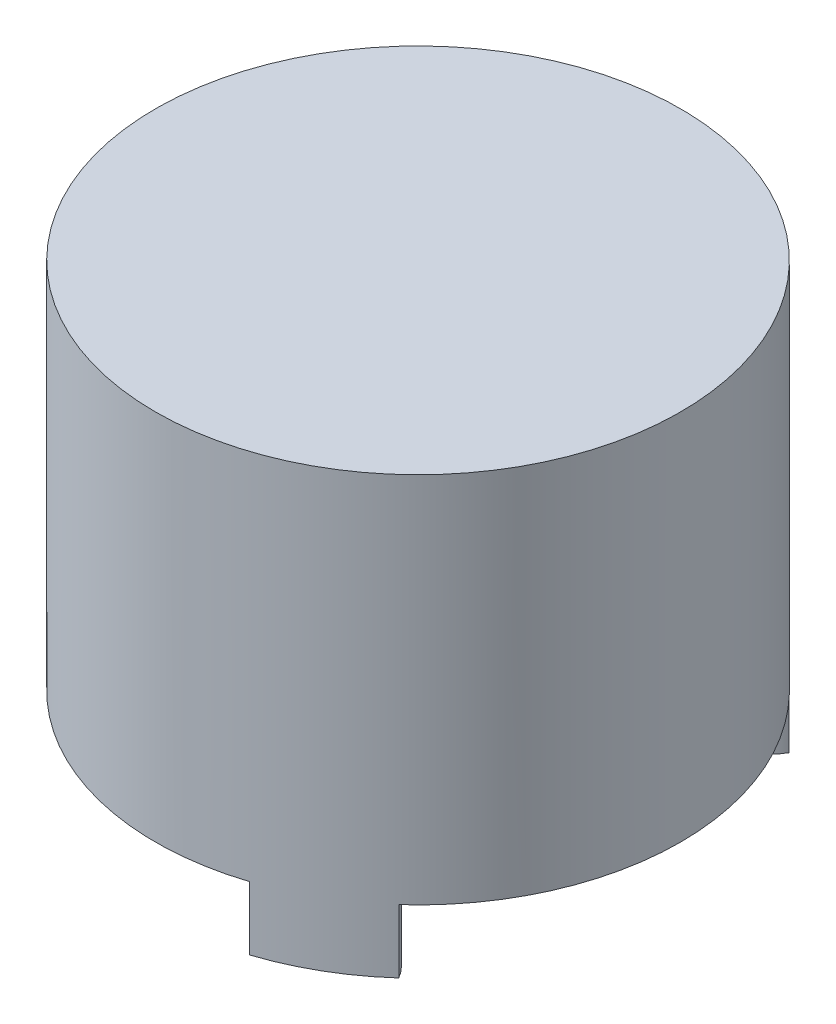
ISO-10303-21;
HEADER;
FILE_DESCRIPTION(('STEP AP214'),'2;1');
FILE_NAME('part.step','',(''),(''),'','','');
FILE_SCHEMA(('AUTOMOTIVE_DESIGN { 1 0 10303 214 1 1 1 1 }'));
ENDSEC;
DATA;
#1=APPLICATION_CONTEXT('core data for automotive mechanical design processes');
#2=APPLICATION_PROTOCOL_DEFINITION('international standard','automotive_design',2000,#1);
#3=PRODUCT_CONTEXT('',#1,'mechanical');
#4=PRODUCT('Part','Part','',(#3));
#5=PRODUCT_RELATED_PRODUCT_CATEGORY('part','',(#4));
#6=PRODUCT_DEFINITION_FORMATION('','',#4);
#7=PRODUCT_DEFINITION_CONTEXT('part definition',#1,'design');
#8=PRODUCT_DEFINITION('design','',#6,#7);
#9=PRODUCT_DEFINITION_SHAPE('','',#8);
#10=(LENGTH_UNIT() NAMED_UNIT(*) SI_UNIT(.MILLI.,.METRE.));
#11=(NAMED_UNIT(*) PLANE_ANGLE_UNIT() SI_UNIT($,.RADIAN.));
#12=(NAMED_UNIT(*) SI_UNIT($,.STERADIAN.) SOLID_ANGLE_UNIT());
#13=UNCERTAINTY_MEASURE_WITH_UNIT(LENGTH_MEASURE(1.E-05),#10,'distance_accuracy_value','');
#14=(GEOMETRIC_REPRESENTATION_CONTEXT(3) GLOBAL_UNCERTAINTY_ASSIGNED_CONTEXT((#13)) GLOBAL_UNIT_ASSIGNED_CONTEXT((#10,
#11,#12)) REPRESENTATION_CONTEXT('',''));
#15=CARTESIAN_POINT('',(0.,0.,0.));
#16=DIRECTION('',(0.,0.,1.));
#17=DIRECTION('',(1.,0.,0.));
#18=AXIS2_PLACEMENT_3D('',#15,#16,#17);
#19=CARTESIAN_POINT('',(0.,139.5,84.));
#20=DIRECTION('',(0.,1.,0.));
#21=DIRECTION('',(0.,0.,1.));
#22=AXIS2_PLACEMENT_3D('',#19,#20,#21);
#23=PLANE('',#22);
#24=CARTESIAN_POINT('',(0.,139.5,0.));
#25=DIRECTION('',(0.,1.,0.));
#26=DIRECTION('',(0.,0.,1.));
#27=AXIS2_PLACEMENT_3D('',#24,#25,#26);
#28=CIRCLE('',#27,84.);
#29=CARTESIAN_POINT('',(0.,139.5,84.));
#30=VERTEX_POINT('',#29);
#31=EDGE_CURVE('E101',#30,#30,#28,.T.);
#32=ORIENTED_EDGE('',*,*,#31,.T.);
#33=EDGE_LOOP('',(#32));
#34=FACE_BOUND('',#33,.T.);
#35=ADVANCED_FACE('F36',(#34),#23,.T.);
#36=CARTESIAN_POINT('',(0.,203.,0.));
#37=DIRECTION('',(0.,-1.,0.));
#38=DIRECTION('',(0.,0.,-1.));
#39=AXIS2_PLACEMENT_3D('',#36,#37,#38);
#40=CYLINDRICAL_SURFACE('',#39,84.);
#41=ORIENTED_EDGE('',*,*,#31,.F.);
#42=EDGE_LOOP('',(#41));
#43=FACE_BOUND('',#42,.T.);
#44=CARTESIAN_POINT('',(0.,20.32,0.));
#45=DIRECTION('',(0.,-1.,0.));
#46=DIRECTION('',(0.,0.,-1.));
#47=AXIS2_PLACEMENT_3D('',#44,#45,#46);
#48=CIRCLE('',#47,84.);
#49=CARTESIAN_POINT('',(56.233875646297,20.32,-62.3999297258964));
#50=VERTEX_POINT('',#49);
#51=CARTESIAN_POINT('',(56.2338756462969,20.32,62.3999297258965));
#52=VERTEX_POINT('',#51);
#53=EDGE_CURVE('E124',#50,#52,#48,.T.);
#54=ORIENTED_EDGE('',*,*,#53,.F.);
#55=DIRECTION('',(0.,-1.,0.));
#56=VECTOR('',#55,1.);
#57=CARTESIAN_POINT('',(56.233875646297,20.32,-62.3999297258964));
#58=LINE('',#57,#56);
#59=CARTESIAN_POINT('',(56.233875646297,0.,-62.3999297258964));
#60=VERTEX_POINT('',#59);
#61=EDGE_CURVE('E89',#50,#60,#58,.T.);
#62=ORIENTED_EDGE('',*,*,#61,.T.);
#63=CARTESIAN_POINT('',(0.,0.,0.));
#64=DIRECTION('',(0.,1.,0.));
#65=DIRECTION('',(0.,0.,1.));
#66=AXIS2_PLACEMENT_3D('',#63,#64,#65);
#67=CIRCLE('',#66,84.);
#68=CARTESIAN_POINT('',(25.9229865138416,0.,-79.8999297258964));
#69=VERTEX_POINT('',#68);
#70=EDGE_CURVE('E94',#60,#69,#67,.T.);
#71=ORIENTED_EDGE('',*,*,#70,.T.);
#72=DIRECTION('',(0.,-1.,0.));
#73=VECTOR('',#72,1.);
#74=CARTESIAN_POINT('',(25.9229865138416,20.32,-79.8999297258964));
#75=LINE('',#74,#73);
#76=CARTESIAN_POINT('',(25.9229865138416,20.32,-79.8999297258964));
#77=VERTEX_POINT('',#76);
#78=EDGE_CURVE('E84',#77,#69,#75,.T.);
#79=ORIENTED_EDGE('',*,*,#78,.F.);
#80=CARTESIAN_POINT('',(-82.1568621601385,20.32,-17.5));
#81=VERTEX_POINT('',#80);
#82=EDGE_CURVE('E103',#81,#77,#48,.T.);
#83=ORIENTED_EDGE('',*,*,#82,.F.);
#84=DIRECTION('',(0.,-1.,0.));
#85=VECTOR('',#84,1.);
#86=CARTESIAN_POINT('',(-82.1568621601385,20.32,-17.5));
#87=LINE('',#86,#85);
#88=CARTESIAN_POINT('',(-82.1568621601385,0.,-17.5));
#89=VERTEX_POINT('',#88);
#90=EDGE_CURVE('E114',#81,#89,#87,.T.);
#91=ORIENTED_EDGE('',*,*,#90,.T.);
#92=CARTESIAN_POINT('',(-82.1568621601385,0.,17.5));
#93=VERTEX_POINT('',#92);
#94=EDGE_CURVE('E97',#89,#93,#67,.T.);
#95=ORIENTED_EDGE('',*,*,#94,.T.);
#96=DIRECTION('',(0.,-1.,0.));
#97=VECTOR('',#96,1.);
#98=CARTESIAN_POINT('',(-82.1568621601385,20.32,17.5));
#99=LINE('',#98,#97);
#100=CARTESIAN_POINT('',(-82.1568621601385,20.32,17.5));
#101=VERTEX_POINT('',#100);
#102=EDGE_CURVE('E112',#101,#93,#99,.T.);
#103=ORIENTED_EDGE('',*,*,#102,.F.);
#104=CARTESIAN_POINT('',(25.9229865138416,20.32,79.8999297258964));
#105=VERTEX_POINT('',#104);
#106=EDGE_CURVE('E123',#105,#101,#48,.T.);
#107=ORIENTED_EDGE('',*,*,#106,.F.);
#108=DIRECTION('',(0.,-1.,0.));
#109=VECTOR('',#108,1.);
#110=CARTESIAN_POINT('',(25.9229865138416,20.32,79.8999297258964));
#111=LINE('',#110,#109);
#112=CARTESIAN_POINT('',(25.9229865138416,0.,79.8999297258964));
#113=VERTEX_POINT('',#112);
#114=EDGE_CURVE('E108',#105,#113,#111,.T.);
#115=ORIENTED_EDGE('',*,*,#114,.T.);
#116=CARTESIAN_POINT('',(56.2338756462969,0.,62.3999297258965));
#117=VERTEX_POINT('',#116);
#118=EDGE_CURVE('E98',#113,#117,#67,.T.);
#119=ORIENTED_EDGE('',*,*,#118,.T.);
#120=DIRECTION('',(0.,-1.,0.));
#121=VECTOR('',#120,1.);
#122=CARTESIAN_POINT('',(56.2338756462969,20.32,62.3999297258965));
#123=LINE('',#122,#121);
#124=EDGE_CURVE('E106',#52,#117,#123,.T.);
#125=ORIENTED_EDGE('',*,*,#124,.F.);
#126=EDGE_LOOP('',(#54,#62,#71,#79,#83,#91,#95,#103,#107,#115,#119,#125));
#127=FACE_BOUND('',#126,.T.);
#128=ADVANCED_FACE('F96',(#43,#127),#40,.T.);
#129=CARTESIAN_POINT('',(0.,0.,0.));
#130=DIRECTION('',(0.,1.,0.));
#131=DIRECTION('',(0.,0.,1.));
#132=AXIS2_PLACEMENT_3D('',#129,#130,#131);
#133=PLANE('',#132);
#134=CARTESIAN_POINT('',(-82.1568621601385,0.,0.));
#135=DIRECTION('',(0.,-1.,0.));
#136=DIRECTION('',(0.,0.,1.));
#137=AXIS2_PLACEMENT_3D('',#134,#135,#136);
#138=CIRCLE('',#137,17.5);
#139=EDGE_CURVE('E111',#89,#93,#138,.T.);
#140=ORIENTED_EDGE('',*,*,#139,.T.);
#141=ORIENTED_EDGE('',*,*,#94,.F.);
#142=EDGE_LOOP('',(#140,#141));
#143=FACE_BOUND('',#142,.T.);
#144=ADVANCED_FACE('F144',(#143),#133,.F.);
#145=CARTESIAN_POINT('',(41.0784310800692,0.,71.1499297258965));
#146=DIRECTION('',(0.,-1.,0.));
#147=DIRECTION('',(0.,0.,1.));
#148=AXIS2_PLACEMENT_3D('',#145,#146,#147);
#149=CIRCLE('',#148,17.5);
#150=EDGE_CURVE('E119',#113,#117,#149,.T.);
#151=ORIENTED_EDGE('',*,*,#150,.T.);
#152=ORIENTED_EDGE('',*,*,#118,.F.);
#153=EDGE_LOOP('',(#151,#152));
#154=FACE_BOUND('',#153,.T.);
#155=ADVANCED_FACE('F142',(#154),#133,.F.);
#156=CARTESIAN_POINT('',(41.0784310800693,0.,-71.1499297258964));
#157=DIRECTION('',(0.,-1.,0.));
#158=DIRECTION('',(0.,0.,1.));
#159=AXIS2_PLACEMENT_3D('',#156,#157,#158);
#160=CIRCLE('',#159,17.5);
#161=EDGE_CURVE('E11',#60,#69,#160,.T.);
#162=ORIENTED_EDGE('',*,*,#161,.T.);
#163=ORIENTED_EDGE('',*,*,#70,.F.);
#164=EDGE_LOOP('',(#162,#163));
#165=FACE_BOUND('',#164,.T.);
#166=ADVANCED_FACE('F93',(#165),#133,.F.);
#167=CARTESIAN_POINT('',(0.,20.32,0.));
#168=DIRECTION('',(0.,-1.,0.));
#169=DIRECTION('',(0.,0.,-1.));
#170=AXIS2_PLACEMENT_3D('',#167,#168,#169);
#171=PLANE('',#170);
#172=ORIENTED_EDGE('',*,*,#53,.T.);
#173=CARTESIAN_POINT('',(41.0784310800692,20.32,71.1499297258965));
#174=DIRECTION('',(0.,-1.,0.));
#175=DIRECTION('',(0.,0.,1.));
#176=AXIS2_PLACEMENT_3D('',#173,#174,#175);
#177=CIRCLE('',#176,17.5);
#178=EDGE_CURVE('E39',#105,#52,#177,.T.);
#179=ORIENTED_EDGE('',*,*,#178,.F.);
#180=ORIENTED_EDGE('',*,*,#106,.T.);
#181=CARTESIAN_POINT('',(-82.1568621601385,20.32,0.));
#182=DIRECTION('',(0.,-1.,0.));
#183=DIRECTION('',(0.,0.,1.));
#184=AXIS2_PLACEMENT_3D('',#181,#182,#183);
#185=CIRCLE('',#184,17.5);
#186=EDGE_CURVE('E116',#81,#101,#185,.T.);
#187=ORIENTED_EDGE('',*,*,#186,.F.);
#188=ORIENTED_EDGE('',*,*,#82,.T.);
#189=CARTESIAN_POINT('',(41.0784310800693,20.32,-71.1499297258964));
#190=DIRECTION('',(0.,-1.,0.));
#191=DIRECTION('',(0.,0.,1.));
#192=AXIS2_PLACEMENT_3D('',#189,#190,#191);
#193=CIRCLE('',#192,17.5);
#194=EDGE_CURVE('E45',#50,#77,#193,.T.);
#195=ORIENTED_EDGE('',*,*,#194,.F.);
#196=EDGE_LOOP('',(#172,#179,#180,#187,#188,#195));
#197=FACE_BOUND('',#196,.T.);
#198=ADVANCED_FACE('F150',(#197),#171,.T.);
#199=CARTESIAN_POINT('',(-82.1568621601385,20.32,0.));
#200=DIRECTION('',(0.,-1.,0.));
#201=DIRECTION('',(0.,0.,-1.));
#202=AXIS2_PLACEMENT_3D('',#199,#200,#201);
#203=CYLINDRICAL_SURFACE('',#202,17.5);
#204=ORIENTED_EDGE('',*,*,#139,.F.);
#205=ORIENTED_EDGE('',*,*,#90,.F.);
#206=ORIENTED_EDGE('',*,*,#186,.T.);
#207=ORIENTED_EDGE('',*,*,#102,.T.);
#208=EDGE_LOOP('',(#204,#205,#206,#207));
#209=FACE_BOUND('',#208,.T.);
#210=ADVANCED_FACE('F166',(#209),#203,.T.);
#211=CARTESIAN_POINT('',(41.0784310800692,20.32,71.1499297258965));
#212=DIRECTION('',(0.,-1.,0.));
#213=DIRECTION('',(0.,0.,-1.));
#214=AXIS2_PLACEMENT_3D('',#211,#212,#213);
#215=CYLINDRICAL_SURFACE('',#214,17.5);
#216=ORIENTED_EDGE('',*,*,#150,.F.);
#217=ORIENTED_EDGE('',*,*,#114,.F.);
#218=ORIENTED_EDGE('',*,*,#178,.T.);
#219=ORIENTED_EDGE('',*,*,#124,.T.);
#220=EDGE_LOOP('',(#216,#217,#218,#219));
#221=FACE_BOUND('',#220,.T.);
#222=ADVANCED_FACE('F140',(#221),#215,.T.);
#223=CARTESIAN_POINT('',(41.0784310800693,20.32,-71.1499297258964));
#224=DIRECTION('',(0.,-1.,0.));
#225=DIRECTION('',(0.,0.,-1.));
#226=AXIS2_PLACEMENT_3D('',#223,#224,#225);
#227=CYLINDRICAL_SURFACE('',#226,17.5);
#228=ORIENTED_EDGE('',*,*,#161,.F.);
#229=ORIENTED_EDGE('',*,*,#61,.F.);
#230=ORIENTED_EDGE('',*,*,#194,.T.);
#231=ORIENTED_EDGE('',*,*,#78,.T.);
#232=EDGE_LOOP('',(#228,#229,#230,#231));
#233=FACE_BOUND('',#232,.T.);
#234=ADVANCED_FACE('F85',(#233),#227,.T.);
#235=CLOSED_SHELL('',(#35,#128,#144,#155,#166,#198,#210,#222,#234));
#236=MANIFOLD_SOLID_BREP('B2',#235);
#237=ADVANCED_BREP_SHAPE_REPRESENTATION('',(#18,#236),#14);
#238=SHAPE_DEFINITION_REPRESENTATION(#9,#237);
ENDSEC;
END-ISO-10303-21;
